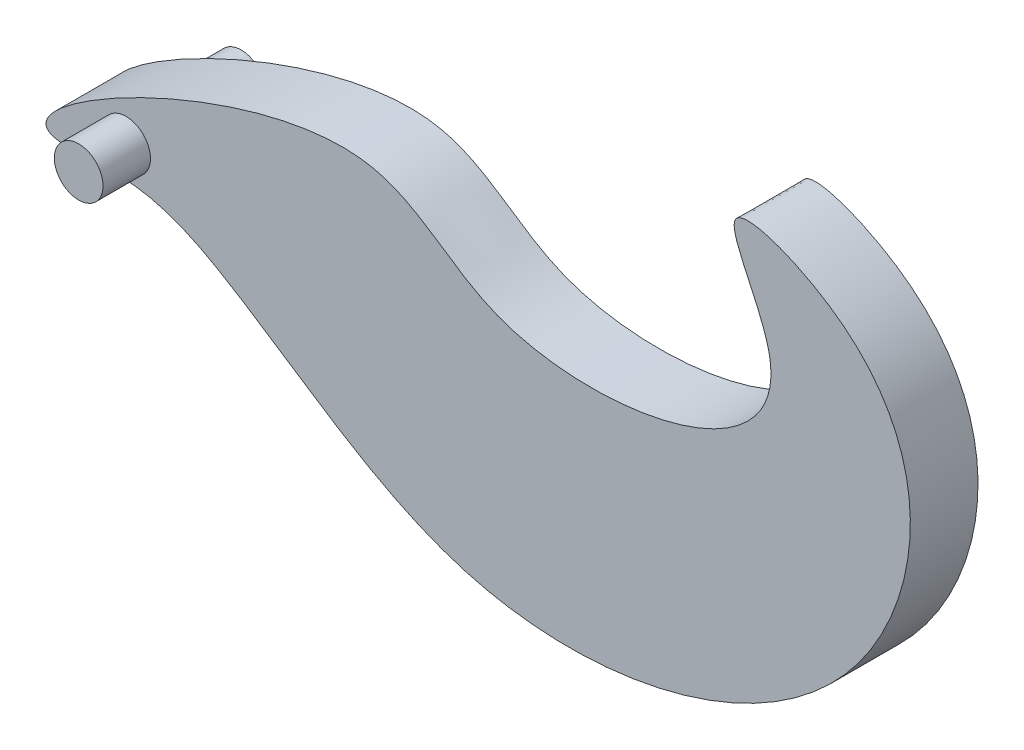
ISO-10303-21;
HEADER;
FILE_DESCRIPTION(('STEP AP214'),'2;1');
FILE_NAME('part.step','',(''),(''),'','','');
FILE_SCHEMA(('AUTOMOTIVE_DESIGN { 1 0 10303 214 1 1 1 1 }'));
ENDSEC;
DATA;
#1=APPLICATION_CONTEXT('core data for automotive mechanical design processes');
#2=APPLICATION_PROTOCOL_DEFINITION('international standard','automotive_design',2000,#1);
#3=PRODUCT_CONTEXT('',#1,'mechanical');
#4=PRODUCT('Part','Part','',(#3));
#5=PRODUCT_RELATED_PRODUCT_CATEGORY('part','',(#4));
#6=PRODUCT_DEFINITION_FORMATION('','',#4);
#7=PRODUCT_DEFINITION_CONTEXT('part definition',#1,'design');
#8=PRODUCT_DEFINITION('design','',#6,#7);
#9=PRODUCT_DEFINITION_SHAPE('','',#8);
#10=(LENGTH_UNIT() NAMED_UNIT(*) SI_UNIT(.MILLI.,.METRE.));
#11=(NAMED_UNIT(*) PLANE_ANGLE_UNIT() SI_UNIT($,.RADIAN.));
#12=(NAMED_UNIT(*) SI_UNIT($,.STERADIAN.) SOLID_ANGLE_UNIT());
#13=UNCERTAINTY_MEASURE_WITH_UNIT(LENGTH_MEASURE(1.E-05),#10,'distance_accuracy_value','');
#14=(GEOMETRIC_REPRESENTATION_CONTEXT(3) GLOBAL_UNCERTAINTY_ASSIGNED_CONTEXT((#13)) GLOBAL_UNIT_ASSIGNED_CONTEXT((#10,
#11,#12)) REPRESENTATION_CONTEXT('',''));
#15=CARTESIAN_POINT('',(0.,0.,0.));
#16=DIRECTION('',(0.,0.,1.));
#17=DIRECTION('',(1.,0.,0.));
#18=AXIS2_PLACEMENT_3D('',#15,#16,#17);
#19=CARTESIAN_POINT('',(42.3506847783348,0.320024175368658,7.08300144676631));
#20=CARTESIAN_POINT('',(37.9053705080958,0.89270777820402,7.08300144676631));
#21=CARTESIAN_POINT('',(60.7392154304537,13.638742028579,7.08300144676631));
#22=CARTESIAN_POINT('',(69.4661648404698,1.00070002217217,7.08300144676631));
#23=CARTESIAN_POINT('',(91.620315672281,5.05872026586625,7.08300144676631));
#24=CARTESIAN_POINT('',(81.2321522216405,19.1037451581892,7.08300144676631));
#25=CARTESIAN_POINT('',(96.4624904913737,13.4063242340495,7.08300144676631));
#26=CARTESIAN_POINT('',(94.5226533677784,-7.99349935827806,7.08300144676631));
#27=CARTESIAN_POINT('',(68.8288966181919,-14.346326664283,7.08300144676631));
#28=CARTESIAN_POINT('',(55.7080130683309,-3.36707298904087,7.08300144676631));
#29=CARTESIAN_POINT('',(47.7593638665435,0.779623157803381,7.08300144676631));
#30=CARTESIAN_POINT('',(43.2533913377549,0.203729755373901,7.08300144676631));
#31=CARTESIAN_POINT('',(42.3506847783348,0.320024175368658,7.08300144676631));
#32=B_SPLINE_CURVE_WITH_KNOTS('',3,(#19,#20,#21,#22,#23,#24,#25,#26,#27,#28,#29,#30,#31),
.UNSPECIFIED.,.T.,.F.,(4,1,1,1,1,1,1,1,1,1,4),(0.,0.156063391963096,0.226928127803843,
0.362315015529695,0.41242395078968,0.462532886049665,0.590286105397676,0.790721846437616,
0.917625991490395,0.968308326690505,1.),.UNSPECIFIED.);
#33=DIRECTION('',(0.,0.,-1.));
#34=VECTOR('',#33,1.);
#35=SURFACE_OF_LINEAR_EXTRUSION('',#32,#34);
#36=CARTESIAN_POINT('',(42.3506847783348,0.320024175368658,7.08300144676631));
#37=VERTEX_POINT('',#36);
#38=EDGE_CURVE('E48',#37,#37,#32,.T.);
#39=ORIENTED_EDGE('',*,*,#38,.T.);
#40=EDGE_LOOP('',(#39));
#41=FACE_BOUND('',#40,.T.);
#42=CARTESIAN_POINT('',(42.3506847783348,0.320024175368658,2.91700144676631));
#43=CARTESIAN_POINT('',(37.9053705080958,0.89270777820402,2.91700144676631));
#44=CARTESIAN_POINT('',(60.7392154304537,13.638742028579,2.91700144676631));
#45=CARTESIAN_POINT('',(69.4661648404698,1.00070002217217,2.91700144676631));
#46=CARTESIAN_POINT('',(91.620315672281,5.05872026586625,2.91700144676631));
#47=CARTESIAN_POINT('',(81.2321522216405,19.1037451581892,2.91700144676631));
#48=CARTESIAN_POINT('',(96.4624904913737,13.4063242340495,2.91700144676631));
#49=CARTESIAN_POINT('',(94.5226533677784,-7.99349935827806,2.91700144676631));
#50=CARTESIAN_POINT('',(68.8288966181919,-14.346326664283,2.91700144676631));
#51=CARTESIAN_POINT('',(55.7080130683309,-3.36707298904087,2.91700144676631));
#52=CARTESIAN_POINT('',(47.7593638665435,0.779623157803381,2.91700144676631));
#53=CARTESIAN_POINT('',(43.2533913377549,0.203729755373901,2.91700144676631));
#54=CARTESIAN_POINT('',(42.3506847783348,0.320024175368658,2.91700144676631));
#55=B_SPLINE_CURVE_WITH_KNOTS('',3,(#42,#43,#44,#45,#46,#47,#48,#49,#50,#51,#52,#53,#54),
.UNSPECIFIED.,.T.,.F.,(4,1,1,1,1,1,1,1,1,1,4),(0.,0.156063391963096,0.226928127803843,
0.362315015529695,0.41242395078968,0.462532886049665,0.590286105397676,0.790721846437616,
0.917625991490395,0.968308326690505,1.),.UNSPECIFIED.);
#56=CARTESIAN_POINT('',(42.3506847783348,0.320024175368658,2.91700144676631));
#57=VERTEX_POINT('',#56);
#58=EDGE_CURVE('E54',#57,#57,#55,.T.);
#59=ORIENTED_EDGE('',*,*,#58,.F.);
#60=EDGE_LOOP('',(#59));
#61=FACE_BOUND('',#60,.T.);
#62=ADVANCED_FACE('F39',(#41,#61),#35,.T.);
#63=CARTESIAN_POINT('',(93.889883556168,10.4708480087131,7.08300144676631));
#64=DIRECTION('',(0.,0.,1.));
#65=DIRECTION('',(1.,0.,0.));
#66=AXIS2_PLACEMENT_3D('',#63,#64,#65);
#67=PLANE('',#66);
#68=CARTESIAN_POINT('',(46.5,2.2,7.08300144676631));
#69=DIRECTION('',(0.,0.,1.));
#70=DIRECTION('',(1.,0.,0.));
#71=AXIS2_PLACEMENT_3D('',#68,#69,#70);
#72=CIRCLE('',#71,1.5);
#73=CARTESIAN_POINT('',(48.,2.2,7.08300144676631));
#74=VERTEX_POINT('',#73);
#75=EDGE_CURVE('E10',#74,#74,#72,.T.);
#76=ORIENTED_EDGE('',*,*,#75,.F.);
#77=EDGE_LOOP('',(#76));
#78=FACE_BOUND('',#77,.T.);
#79=ORIENTED_EDGE('',*,*,#38,.F.);
#80=EDGE_LOOP('',(#79));
#81=FACE_BOUND('',#80,.T.);
#82=ADVANCED_FACE('F101',(#78,#81),#67,.T.);
#83=CARTESIAN_POINT('',(93.889883556168,10.4708480087131,2.91700144676631));
#84=DIRECTION('',(0.,0.,1.));
#85=DIRECTION('',(1.,0.,0.));
#86=AXIS2_PLACEMENT_3D('',#83,#84,#85);
#87=PLANE('',#86);
#88=CARTESIAN_POINT('',(46.5,2.2,2.91700144676631));
#89=DIRECTION('',(0.,0.,1.));
#90=DIRECTION('',(1.,0.,0.));
#91=AXIS2_PLACEMENT_3D('',#88,#89,#90);
#92=CIRCLE('',#91,1.5);
#93=CARTESIAN_POINT('',(48.,2.2,2.91700144676631));
#94=VERTEX_POINT('',#93);
#95=EDGE_CURVE('E43',#94,#94,#92,.T.);
#96=ORIENTED_EDGE('',*,*,#95,.T.);
#97=EDGE_LOOP('',(#96));
#98=FACE_BOUND('',#97,.T.);
#99=ORIENTED_EDGE('',*,*,#58,.T.);
#100=EDGE_LOOP('',(#99));
#101=FACE_BOUND('',#100,.T.);
#102=ADVANCED_FACE('F106',(#98,#101),#87,.F.);
#103=CARTESIAN_POINT('',(46.5,2.2,1.44676630658286E-06));
#104=DIRECTION('',(0.,0.,1.));
#105=DIRECTION('',(1.,0.,0.));
#106=AXIS2_PLACEMENT_3D('',#103,#104,#105);
#107=PLANE('',#106);
#108=CARTESIAN_POINT('',(46.5,2.2,1.44676630658286E-06));
#109=DIRECTION('',(0.,0.,1.));
#110=DIRECTION('',(1.,0.,0.));
#111=AXIS2_PLACEMENT_3D('',#108,#109,#110);
#112=CIRCLE('',#111,1.5);
#113=CARTESIAN_POINT('',(48.,2.2,1.44676630658286E-06));
#114=VERTEX_POINT('',#113);
#115=EDGE_CURVE('E56',#114,#114,#112,.T.);
#116=ORIENTED_EDGE('',*,*,#115,.F.);
#117=EDGE_LOOP('',(#116));
#118=FACE_BOUND('',#117,.T.);
#119=ADVANCED_FACE('F97',(#118),#107,.F.);
#120=CARTESIAN_POINT('',(46.5,2.2,1.44676630658286E-06));
#121=DIRECTION('',(0.,0.,1.));
#122=DIRECTION('',(1.,0.,0.));
#123=AXIS2_PLACEMENT_3D('',#120,#121,#122);
#124=CYLINDRICAL_SURFACE('',#123,1.5);
#125=ORIENTED_EDGE('',*,*,#115,.T.);
#126=EDGE_LOOP('',(#125));
#127=FACE_BOUND('',#126,.T.);
#128=ORIENTED_EDGE('',*,*,#95,.F.);
#129=EDGE_LOOP('',(#128));
#130=FACE_BOUND('',#129,.T.);
#131=ADVANCED_FACE('F90',(#127,#130),#124,.T.);
#132=ORIENTED_EDGE('',*,*,#75,.T.);
#133=EDGE_LOOP('',(#132));
#134=FACE_BOUND('',#133,.T.);
#135=CARTESIAN_POINT('',(46.5,2.2,10.0000014467663));
#136=DIRECTION('',(0.,0.,1.));
#137=DIRECTION('',(1.,0.,0.));
#138=AXIS2_PLACEMENT_3D('',#135,#136,#137);
#139=CIRCLE('',#138,1.5);
#140=CARTESIAN_POINT('',(48.,2.2,10.0000014467663));
#141=VERTEX_POINT('',#140);
#142=EDGE_CURVE('E79',#141,#141,#139,.T.);
#143=ORIENTED_EDGE('',*,*,#142,.F.);
#144=EDGE_LOOP('',(#143));
#145=FACE_BOUND('',#144,.T.);
#146=ADVANCED_FACE('F88',(#134,#145),#124,.T.);
#147=CARTESIAN_POINT('',(46.5,2.2,10.0000014467663));
#148=DIRECTION('',(0.,0.,1.));
#149=DIRECTION('',(1.,0.,0.));
#150=AXIS2_PLACEMENT_3D('',#147,#148,#149);
#151=PLANE('',#150);
#152=ORIENTED_EDGE('',*,*,#142,.T.);
#153=EDGE_LOOP('',(#152));
#154=FACE_BOUND('',#153,.T.);
#155=ADVANCED_FACE('F86',(#154),#151,.T.);
#156=CLOSED_SHELL('',(#62,#82,#102,#119,#131,#146,#155));
#157=MANIFOLD_SOLID_BREP('B2',#156);
#158=ADVANCED_BREP_SHAPE_REPRESENTATION('',(#18,#157),#14);
#159=SHAPE_DEFINITION_REPRESENTATION(#9,#158);
ENDSEC;
END-ISO-10303-21;
